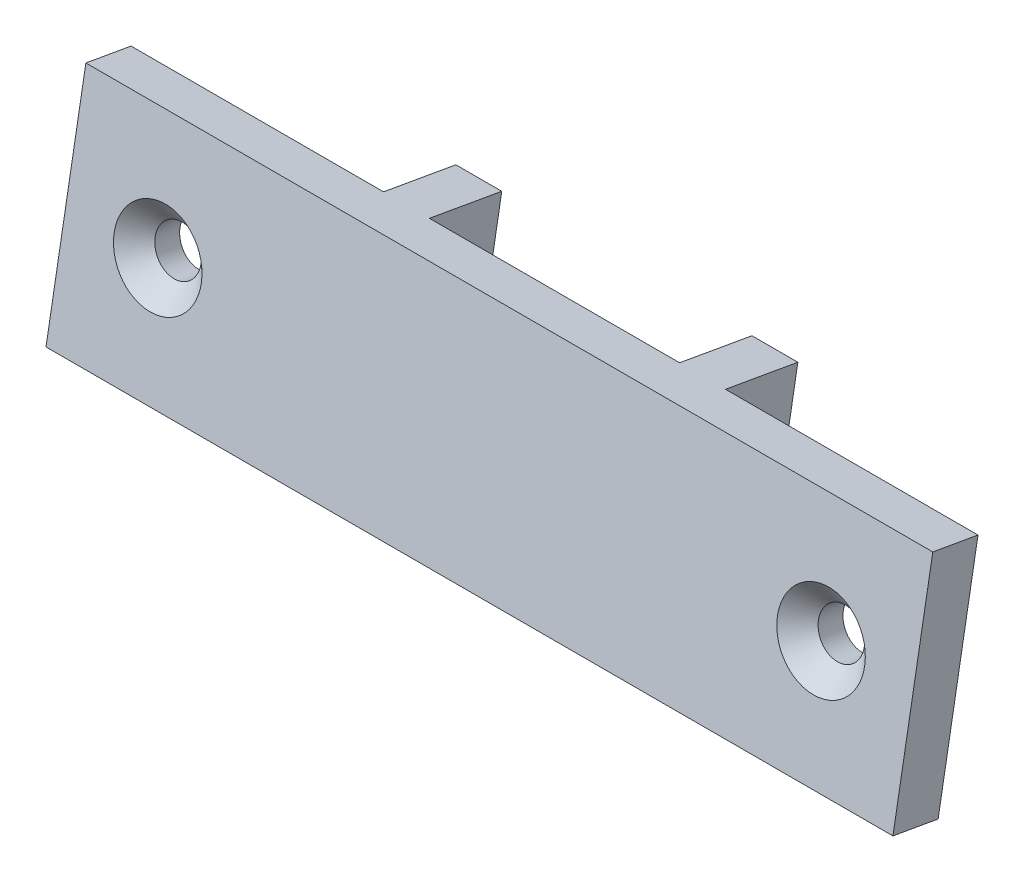
ISO-10303-21;
HEADER;
FILE_DESCRIPTION(('STEP AP214'),'2;1');
FILE_NAME('part.step','',(''),(''),'','','');
FILE_SCHEMA(('AUTOMOTIVE_DESIGN { 1 0 10303 214 1 1 1 1 }'));
ENDSEC;
DATA;
#1=APPLICATION_CONTEXT('core data for automotive mechanical design processes');
#2=APPLICATION_PROTOCOL_DEFINITION('international standard','automotive_design',2000,#1);
#3=PRODUCT_CONTEXT('',#1,'mechanical');
#4=PRODUCT('Part','Part','',(#3));
#5=PRODUCT_RELATED_PRODUCT_CATEGORY('part','',(#4));
#6=PRODUCT_DEFINITION_FORMATION('','',#4);
#7=PRODUCT_DEFINITION_CONTEXT('part definition',#1,'design');
#8=PRODUCT_DEFINITION('design','',#6,#7);
#9=PRODUCT_DEFINITION_SHAPE('','',#8);
#10=(LENGTH_UNIT() NAMED_UNIT(*) SI_UNIT(.MILLI.,.METRE.));
#11=(NAMED_UNIT(*) PLANE_ANGLE_UNIT() SI_UNIT($,.RADIAN.));
#12=(NAMED_UNIT(*) SI_UNIT($,.STERADIAN.) SOLID_ANGLE_UNIT());
#13=UNCERTAINTY_MEASURE_WITH_UNIT(LENGTH_MEASURE(1.E-05),#10,'distance_accuracy_value','');
#14=(GEOMETRIC_REPRESENTATION_CONTEXT(3) GLOBAL_UNCERTAINTY_ASSIGNED_CONTEXT((#13)) GLOBAL_UNIT_ASSIGNED_CONTEXT((#10,
#11,#12)) REPRESENTATION_CONTEXT('',''));
#15=CARTESIAN_POINT('',(0.,0.,0.));
#16=DIRECTION('',(0.,0.,1.));
#17=DIRECTION('',(1.,0.,0.));
#18=AXIS2_PLACEMENT_3D('',#15,#16,#17);
#19=CARTESIAN_POINT('',(0.,-1.36313819468535,-7.73074086114584));
#20=DIRECTION('',(0.,0.173648177666923,0.984807753012209));
#21=DIRECTION('',(0.,-0.984807753012209,0.173648177666923));
#22=AXIS2_PLACEMENT_3D('',#19,#20,#21);
#23=PLANE('',#22);
#24=CARTESIAN_POINT('',(14.45,-9.6355233199879,-6.27209616874369));
#25=DIRECTION('',(0.,0.173648177666923,0.984807753012209));
#26=DIRECTION('',(0.,-0.984807753012209,0.173648177666923));
#27=AXIS2_PLACEMENT_3D('',#24,#25,#26);
#28=CIRCLE('',#27,1.);
#29=CARTESIAN_POINT('',(14.45,-10.6203310730001,-6.09844799107677));
#30=VERTEX_POINT('',#29);
#31=EDGE_CURVE('E197',#30,#30,#28,.T.);
#32=ORIENTED_EDGE('',*,*,#31,.T.);
#33=EDGE_LOOP('',(#32));
#34=FACE_BOUND('',#33,.T.);
#35=DIRECTION('',(0.,-0.984807753012209,0.173648177666923));
#36=VECTOR('',#35,1.);
#37=CARTESIAN_POINT('',(7.45,-4.71148455492685,-7.14033705707831));
#38=LINE('',#37,#36);
#39=CARTESIAN_POINT('',(7.45,-4.71148455492685,-7.14033705707831));
#40=VERTEX_POINT('',#39);
#41=CARTESIAN_POINT('',(7.45,-14.5595620850489,-5.40385528040907));
#42=VERTEX_POINT('',#41);
#43=EDGE_CURVE('E162',#40,#42,#38,.T.);
#44=ORIENTED_EDGE('',*,*,#43,.F.);
#45=DIRECTION('',(-1.,0.,0.));
#46=VECTOR('',#45,1.);
#47=CARTESIAN_POINT('',(-18.45,-4.71148455492685,-7.14033705707831));
#48=LINE('',#47,#46);
#49=CARTESIAN_POINT('',(18.45,-4.71148455492685,-7.14033705707831));
#50=VERTEX_POINT('',#49);
#51=EDGE_CURVE('E214',#50,#40,#48,.T.);
#52=ORIENTED_EDGE('',*,*,#51,.F.);
#53=DIRECTION('',(0.,0.984807753012209,-0.173648177666923));
#54=VECTOR('',#53,1.);
#55=CARTESIAN_POINT('',(18.45,-4.71148455492685,-7.14033705707831));
#56=LINE('',#55,#54);
#57=CARTESIAN_POINT('',(18.45,-14.5595620850489,-5.40385528040907));
#58=VERTEX_POINT('',#57);
#59=EDGE_CURVE('E209',#58,#50,#56,.T.);
#60=ORIENTED_EDGE('',*,*,#59,.F.);
#61=DIRECTION('',(1.,0.,0.));
#62=VECTOR('',#61,1.);
#63=CARTESIAN_POINT('',(-18.45,-14.5595620850489,-5.40385528040907));
#64=LINE('',#63,#62);
#65=EDGE_CURVE('E57',#42,#58,#64,.T.);
#66=ORIENTED_EDGE('',*,*,#65,.F.);
#67=EDGE_LOOP('',(#44,#52,#60,#66));
#68=FACE_BOUND('',#67,.T.);
#69=ADVANCED_FACE('F41',(#34,#68),#23,.F.);
#70=DIRECTION('',(0.,0.984807753012209,-0.173648177666923));
#71=VECTOR('',#70,1.);
#72=CARTESIAN_POINT('',(5.45,-4.71148455492685,-7.14033705707831));
#73=LINE('',#72,#71);
#74=CARTESIAN_POINT('',(5.45,-14.5595620850489,-5.40385528040907));
#75=VERTEX_POINT('',#74);
#76=CARTESIAN_POINT('',(5.45,-4.71148455492685,-7.14033705707831));
#77=VERTEX_POINT('',#76);
#78=EDGE_CURVE('E65',#75,#77,#73,.T.);
#79=ORIENTED_EDGE('',*,*,#78,.F.);
#80=CARTESIAN_POINT('',(-5.45,-14.559562085049,-5.40385528040908));
#81=VERTEX_POINT('',#80);
#82=EDGE_CURVE('E210',#81,#75,#64,.T.);
#83=ORIENTED_EDGE('',*,*,#82,.F.);
#84=DIRECTION('',(0.,-0.984807753012209,0.173648177666923));
#85=VECTOR('',#84,1.);
#86=CARTESIAN_POINT('',(-5.45,-14.559562085049,-5.40385528040908));
#87=LINE('',#86,#85);
#88=CARTESIAN_POINT('',(-5.45,-4.71148455492685,-7.14033705707831));
#89=VERTEX_POINT('',#88);
#90=EDGE_CURVE('E178',#89,#81,#87,.T.);
#91=ORIENTED_EDGE('',*,*,#90,.F.);
#92=EDGE_CURVE('E216',#77,#89,#48,.T.);
#93=ORIENTED_EDGE('',*,*,#92,.F.);
#94=EDGE_LOOP('',(#79,#83,#91,#93));
#95=FACE_BOUND('',#94,.T.);
#96=ADVANCED_FACE('F255',(#95),#23,.F.);
#97=CARTESIAN_POINT('',(-14.45,-9.6355233199879,-6.27209616874369));
#98=DIRECTION('',(0.,0.173648177666923,0.984807753012209));
#99=DIRECTION('',(0.,-0.984807753012209,0.173648177666923));
#100=AXIS2_PLACEMENT_3D('',#97,#98,#99);
#101=CIRCLE('',#100,1.);
#102=CARTESIAN_POINT('',(-14.45,-10.6203310730001,-6.09844799107677));
#103=VERTEX_POINT('',#102);
#104=EDGE_CURVE('E278',#103,#103,#101,.F.);
#105=ORIENTED_EDGE('',*,*,#104,.F.);
#106=EDGE_LOOP('',(#105));
#107=FACE_BOUND('',#106,.T.);
#108=DIRECTION('',(0.,0.984807753012209,-0.173648177666923));
#109=VECTOR('',#108,1.);
#110=CARTESIAN_POINT('',(-7.45,-14.559562085049,-5.40385528040908));
#111=LINE('',#110,#109);
#112=CARTESIAN_POINT('',(-7.45,-14.5595620850489,-5.40385528040907));
#113=VERTEX_POINT('',#112);
#114=CARTESIAN_POINT('',(-7.45,-4.71148455492685,-7.14033705707831));
#115=VERTEX_POINT('',#114);
#116=EDGE_CURVE('E174',#113,#115,#111,.T.);
#117=ORIENTED_EDGE('',*,*,#116,.F.);
#118=CARTESIAN_POINT('',(-18.45,-14.5595620850489,-5.40385528040907));
#119=VERTEX_POINT('',#118);
#120=EDGE_CURVE('E206',#119,#113,#64,.T.);
#121=ORIENTED_EDGE('',*,*,#120,.F.);
#122=DIRECTION('',(0.,-0.984807753012209,0.173648177666923));
#123=VECTOR('',#122,1.);
#124=CARTESIAN_POINT('',(-18.45,-4.71148455492685,-7.14033705707831));
#125=LINE('',#124,#123);
#126=CARTESIAN_POINT('',(-18.45,-4.71148455492685,-7.14033705707831));
#127=VERTEX_POINT('',#126);
#128=EDGE_CURVE('E202',#127,#119,#125,.T.);
#129=ORIENTED_EDGE('',*,*,#128,.F.);
#130=EDGE_CURVE('E213',#115,#127,#48,.T.);
#131=ORIENTED_EDGE('',*,*,#130,.F.);
#132=EDGE_LOOP('',(#117,#121,#129,#131));
#133=FACE_BOUND('',#132,.T.);
#134=ADVANCED_FACE('F258',(#107,#133),#23,.F.);
#135=CARTESIAN_POINT('',(-18.45,-4.71148455492685,-7.14033705707831));
#136=DIRECTION('',(-1.,0.,0.));
#137=DIRECTION('',(0.,0.,1.));
#138=AXIS2_PLACEMENT_3D('',#135,#136,#137);
#139=PLANE('',#138);
#140=DIRECTION('',(0.,-0.984807753012209,0.173648177666923));
#141=VECTOR('',#140,1.);
#142=CARTESIAN_POINT('',(-18.45,-4.36418819959301,-5.17072155105389));
#143=LINE('',#142,#141);
#144=CARTESIAN_POINT('',(-18.45,-4.36418819959301,-5.17072155105389));
#145=VERTEX_POINT('',#144);
#146=CARTESIAN_POINT('',(-18.45,-14.2122657297151,-3.43423977438465));
#147=VERTEX_POINT('',#146);
#148=EDGE_CURVE('E155',#145,#147,#143,.T.);
#149=ORIENTED_EDGE('',*,*,#148,.F.);
#150=DIRECTION('',(0.,0.173648177666923,0.984807753012209));
#151=VECTOR('',#150,1.);
#152=CARTESIAN_POINT('',(-18.45,-4.71148455492685,-7.14033705707831));
#153=LINE('',#152,#151);
#154=EDGE_CURVE('E225',#127,#145,#153,.T.);
#155=ORIENTED_EDGE('',*,*,#154,.F.);
#156=ORIENTED_EDGE('',*,*,#128,.T.);
#157=DIRECTION('',(0.,0.173648177666923,0.984807753012209));
#158=VECTOR('',#157,1.);
#159=CARTESIAN_POINT('',(-18.45,-14.5595620850489,-5.40385528040907));
#160=LINE('',#159,#158);
#161=EDGE_CURVE('E215',#119,#147,#160,.T.);
#162=ORIENTED_EDGE('',*,*,#161,.T.);
#163=EDGE_LOOP('',(#149,#155,#156,#162));
#164=FACE_BOUND('',#163,.T.);
#165=ADVANCED_FACE('F267',(#164),#139,.T.);
#166=CARTESIAN_POINT('',(-18.45,-4.71148455492685,-7.14033705707831));
#167=DIRECTION('',(0.,0.984807753012209,-0.173648177666923));
#168=DIRECTION('',(0.,0.173648177666923,0.984807753012209));
#169=AXIS2_PLACEMENT_3D('',#166,#167,#168);
#170=PLANE('',#169);
#171=DIRECTION('',(-1.,0.,0.));
#172=VECTOR('',#171,1.);
#173=CARTESIAN_POINT('',(-18.45,-4.36418819959301,-5.17072155105389));
#174=LINE('',#173,#172);
#175=CARTESIAN_POINT('',(18.45,-4.36418819959301,-5.17072155105389));
#176=VERTEX_POINT('',#175);
#177=EDGE_CURVE('E205',#176,#145,#174,.T.);
#178=ORIENTED_EDGE('',*,*,#177,.F.);
#179=DIRECTION('',(0.,0.173648177666923,0.984807753012209));
#180=VECTOR('',#179,1.);
#181=CARTESIAN_POINT('',(18.45,-4.71148455492685,-7.14033705707831));
#182=LINE('',#181,#180);
#183=EDGE_CURVE('E228',#50,#176,#182,.T.);
#184=ORIENTED_EDGE('',*,*,#183,.F.);
#185=ORIENTED_EDGE('',*,*,#51,.T.);
#186=DIRECTION('',(0.,0.173648177666923,0.984807753012209));
#187=VECTOR('',#186,1.);
#188=CARTESIAN_POINT('',(7.45,-7.29850188280833,-21.8120413957292));
#189=LINE('',#188,#187);
#190=CARTESIAN_POINT('',(7.45,-5.26715872346101,-10.2917218667174));
#191=VERTEX_POINT('',#190);
#192=EDGE_CURVE('E146',#191,#40,#189,.T.);
#193=ORIENTED_EDGE('',*,*,#192,.F.);
#194=DIRECTION('',(1.,0.,0.));
#195=VECTOR('',#194,1.);
#196=CARTESIAN_POINT('',(7.45,-5.26715872346101,-10.2917218667174));
#197=LINE('',#196,#195);
#198=CARTESIAN_POINT('',(5.45,-5.26715872346101,-10.2917218667174));
#199=VERTEX_POINT('',#198);
#200=EDGE_CURVE('E139',#199,#191,#197,.T.);
#201=ORIENTED_EDGE('',*,*,#200,.F.);
#202=DIRECTION('',(0.,0.173648177666923,0.984807753012209));
#203=VECTOR('',#202,1.);
#204=CARTESIAN_POINT('',(5.45,-7.29850188280834,-21.8120413957292));
#205=LINE('',#204,#203);
#206=EDGE_CURVE('E130',#199,#77,#205,.T.);
#207=ORIENTED_EDGE('',*,*,#206,.T.);
#208=ORIENTED_EDGE('',*,*,#92,.T.);
#209=DIRECTION('',(0.,0.173648177666923,0.984807753012209));
#210=VECTOR('',#209,1.);
#211=CARTESIAN_POINT('',(-5.45,-7.29850188280834,-21.8120413957292));
#212=LINE('',#211,#210);
#213=CARTESIAN_POINT('',(-5.45,-5.26715872346101,-10.2917218667174));
#214=VERTEX_POINT('',#213);
#215=EDGE_CURVE('E180',#214,#89,#212,.T.);
#216=ORIENTED_EDGE('',*,*,#215,.F.);
#217=DIRECTION('',(1.,0.,0.));
#218=VECTOR('',#217,1.);
#219=CARTESIAN_POINT('',(-7.45,-5.26715872346101,-10.2917218667174));
#220=LINE('',#219,#218);
#221=CARTESIAN_POINT('',(-7.45,-5.26715872346101,-10.2917218667174));
#222=VERTEX_POINT('',#221);
#223=EDGE_CURVE('E191',#222,#214,#220,.T.);
#224=ORIENTED_EDGE('',*,*,#223,.F.);
#225=DIRECTION('',(0.,0.173648177666923,0.984807753012209));
#226=VECTOR('',#225,1.);
#227=CARTESIAN_POINT('',(-7.45,-7.29850188280833,-21.8120413957292));
#228=LINE('',#227,#226);
#229=EDGE_CURVE('E183',#222,#115,#228,.T.);
#230=ORIENTED_EDGE('',*,*,#229,.T.);
#231=ORIENTED_EDGE('',*,*,#130,.T.);
#232=ORIENTED_EDGE('',*,*,#154,.T.);
#233=EDGE_LOOP('',(#178,#184,#185,#193,#201,#207,#208,#216,#224,#230,#231,#232));
#234=FACE_BOUND('',#233,.T.);
#235=ADVANCED_FACE('F143',(#234),#170,.T.);
#236=CARTESIAN_POINT('',(18.45,-4.71148455492685,-7.14033705707831));
#237=DIRECTION('',(1.,0.,0.));
#238=DIRECTION('',(0.,0.,-1.));
#239=AXIS2_PLACEMENT_3D('',#236,#237,#238);
#240=PLANE('',#239);
#241=DIRECTION('',(0.,0.984807753012209,-0.173648177666923));
#242=VECTOR('',#241,1.);
#243=CARTESIAN_POINT('',(18.45,-4.36418819959301,-5.17072155105389));
#244=LINE('',#243,#242);
#245=CARTESIAN_POINT('',(18.45,-14.2122657297151,-3.43423977438465));
#246=VERTEX_POINT('',#245);
#247=EDGE_CURVE('E220',#246,#176,#244,.T.);
#248=ORIENTED_EDGE('',*,*,#247,.F.);
#249=DIRECTION('',(0.,0.173648177666923,0.984807753012209));
#250=VECTOR('',#249,1.);
#251=CARTESIAN_POINT('',(18.45,-14.5595620850489,-5.40385528040907));
#252=LINE('',#251,#250);
#253=EDGE_CURVE('E230',#58,#246,#252,.T.);
#254=ORIENTED_EDGE('',*,*,#253,.F.);
#255=ORIENTED_EDGE('',*,*,#59,.T.);
#256=ORIENTED_EDGE('',*,*,#183,.T.);
#257=EDGE_LOOP('',(#248,#254,#255,#256));
#258=FACE_BOUND('',#257,.T.);
#259=ADVANCED_FACE('F301',(#258),#240,.T.);
#260=CARTESIAN_POINT('',(-18.45,-14.5595620850489,-5.40385528040907));
#261=DIRECTION('',(0.,-0.984807753012209,0.173648177666923));
#262=DIRECTION('',(0.,-0.173648177666923,-0.984807753012209));
#263=AXIS2_PLACEMENT_3D('',#260,#261,#262);
#264=PLANE('',#263);
#265=DIRECTION('',(1.,0.,0.));
#266=VECTOR('',#265,1.);
#267=CARTESIAN_POINT('',(-18.45,-14.2122657297151,-3.43423977438465));
#268=LINE('',#267,#266);
#269=EDGE_CURVE('E158',#147,#246,#268,.T.);
#270=ORIENTED_EDGE('',*,*,#269,.F.);
#271=ORIENTED_EDGE('',*,*,#161,.F.);
#272=ORIENTED_EDGE('',*,*,#120,.T.);
#273=DIRECTION('',(0.,0.173648177666923,0.984807753012209));
#274=VECTOR('',#273,1.);
#275=CARTESIAN_POINT('',(-7.45,-17.1465794129304,-20.0755596190599));
#276=LINE('',#275,#274);
#277=CARTESIAN_POINT('',(-7.45,-15.1152362535831,-8.55524009004817));
#278=VERTEX_POINT('',#277);
#279=EDGE_CURVE('E171',#278,#113,#276,.T.);
#280=ORIENTED_EDGE('',*,*,#279,.F.);
#281=DIRECTION('',(-1.,0.,0.));
#282=VECTOR('',#281,1.);
#283=CARTESIAN_POINT('',(-7.45,-15.1152362535831,-8.55524009004817));
#284=LINE('',#283,#282);
#285=CARTESIAN_POINT('',(-5.45,-15.1152362535831,-8.55524009004817));
#286=VERTEX_POINT('',#285);
#287=EDGE_CURVE('E179',#286,#278,#284,.T.);
#288=ORIENTED_EDGE('',*,*,#287,.F.);
#289=DIRECTION('',(0.,0.173648177666923,0.984807753012209));
#290=VECTOR('',#289,1.);
#291=CARTESIAN_POINT('',(-5.45,-17.1465794129304,-20.0755596190599));
#292=LINE('',#291,#290);
#293=EDGE_CURVE('E175',#286,#81,#292,.T.);
#294=ORIENTED_EDGE('',*,*,#293,.T.);
#295=ORIENTED_EDGE('',*,*,#82,.T.);
#296=DIRECTION('',(0.,0.173648177666923,0.984807753012209));
#297=VECTOR('',#296,1.);
#298=CARTESIAN_POINT('',(5.45,-17.1465794129304,-20.0755596190599));
#299=LINE('',#298,#297);
#300=CARTESIAN_POINT('',(5.45,-15.1152362535831,-8.55524009004817));
#301=VERTEX_POINT('',#300);
#302=EDGE_CURVE('E168',#301,#75,#299,.T.);
#303=ORIENTED_EDGE('',*,*,#302,.F.);
#304=DIRECTION('',(-1.,0.,0.));
#305=VECTOR('',#304,1.);
#306=CARTESIAN_POINT('',(7.45,-15.1152362535831,-8.55524009004817));
#307=LINE('',#306,#305);
#308=CARTESIAN_POINT('',(7.45,-15.1152362535831,-8.55524009004817));
#309=VERTEX_POINT('',#308);
#310=EDGE_CURVE('E154',#309,#301,#307,.T.);
#311=ORIENTED_EDGE('',*,*,#310,.F.);
#312=DIRECTION('',(0.,0.173648177666923,0.984807753012209));
#313=VECTOR('',#312,1.);
#314=CARTESIAN_POINT('',(7.45,-17.1465794129304,-20.0755596190599));
#315=LINE('',#314,#313);
#316=EDGE_CURVE('E166',#309,#42,#315,.T.);
#317=ORIENTED_EDGE('',*,*,#316,.T.);
#318=ORIENTED_EDGE('',*,*,#65,.T.);
#319=ORIENTED_EDGE('',*,*,#253,.T.);
#320=EDGE_LOOP('',(#270,#271,#272,#280,#288,#294,#295,#303,#311,#317,#318,#319));
#321=FACE_BOUND('',#320,.T.);
#322=ADVANCED_FACE('F285',(#321),#264,.T.);
#323=CARTESIAN_POINT('',(0.,-1.0158418393515,-5.76112535512143));
#324=DIRECTION('',(0.,0.173648177666923,0.984807753012209));
#325=DIRECTION('',(0.,-0.984807753012209,0.173648177666923));
#326=AXIS2_PLACEMENT_3D('',#323,#324,#325);
#327=PLANE('',#326);
#328=CARTESIAN_POINT('',(-14.45,-9.28822696465405,-4.30248066271927));
#329=DIRECTION('',(0.,0.173648177666923,0.984807753012209));
#330=DIRECTION('',(0.,-0.984807753012209,0.173648177666923));
#331=AXIS2_PLACEMENT_3D('',#328,#329,#330);
#332=CIRCLE('',#331,1.90000000000002);
#333=CARTESIAN_POINT('',(-14.45,-11.1593616953773,-3.97254912515211));
#334=VERTEX_POINT('',#333);
#335=EDGE_CURVE('E50',#334,#334,#332,.F.);
#336=ORIENTED_EDGE('',*,*,#335,.T.);
#337=EDGE_LOOP('',(#336));
#338=FACE_BOUND('',#337,.T.);
#339=CARTESIAN_POINT('',(14.45,-9.28822696465406,-4.30248066271927));
#340=DIRECTION('',(0.,0.173648177666923,0.984807753012209));
#341=DIRECTION('',(0.,-0.984807753012209,0.173648177666923));
#342=AXIS2_PLACEMENT_3D('',#339,#340,#341);
#343=CIRCLE('',#342,1.89999999999995);
#344=CARTESIAN_POINT('',(14.45,-11.1593616953772,-3.97254912515213));
#345=VERTEX_POINT('',#344);
#346=EDGE_CURVE('E235',#345,#345,#343,.F.);
#347=ORIENTED_EDGE('',*,*,#346,.T.);
#348=EDGE_LOOP('',(#347));
#349=FACE_BOUND('',#348,.T.);
#350=ORIENTED_EDGE('',*,*,#148,.T.);
#351=ORIENTED_EDGE('',*,*,#269,.T.);
#352=ORIENTED_EDGE('',*,*,#247,.T.);
#353=ORIENTED_EDGE('',*,*,#177,.T.);
#354=EDGE_LOOP('',(#350,#351,#352,#353));
#355=FACE_BOUND('',#354,.T.);
#356=ADVANCED_FACE('F240',(#338,#349,#355),#327,.T.);
#357=CARTESIAN_POINT('',(-7.45,-17.1465794129304,-20.0755596190599));
#358=DIRECTION('',(1.,0.,0.));
#359=DIRECTION('',(0.,1.,0.));
#360=AXIS2_PLACEMENT_3D('',#357,#358,#359);
#361=PLANE('',#360);
#362=DIRECTION('',(0.,0.984807753012209,-0.173648177666923));
#363=VECTOR('',#362,1.);
#364=CARTESIAN_POINT('',(-7.45,-15.1152362535831,-8.55524009004817));
#365=LINE('',#364,#363);
#366=EDGE_CURVE('E188',#278,#222,#365,.T.);
#367=ORIENTED_EDGE('',*,*,#366,.F.);
#368=ORIENTED_EDGE('',*,*,#279,.T.);
#369=ORIENTED_EDGE('',*,*,#116,.T.);
#370=ORIENTED_EDGE('',*,*,#229,.F.);
#371=EDGE_LOOP('',(#367,#368,#369,#370));
#372=FACE_BOUND('',#371,.T.);
#373=ADVANCED_FACE('F288',(#372),#361,.F.);
#374=CARTESIAN_POINT('',(-5.45,-17.1465794129304,-20.0755596190599));
#375=DIRECTION('',(-1.,0.,0.));
#376=DIRECTION('',(0.,-1.,0.));
#377=AXIS2_PLACEMENT_3D('',#374,#375,#376);
#378=PLANE('',#377);
#379=DIRECTION('',(0.,-0.984807753012209,0.173648177666923));
#380=VECTOR('',#379,1.);
#381=CARTESIAN_POINT('',(-5.45,-15.1152362535831,-8.55524009004817));
#382=LINE('',#381,#380);
#383=EDGE_CURVE('E194',#214,#286,#382,.T.);
#384=ORIENTED_EDGE('',*,*,#383,.F.);
#385=ORIENTED_EDGE('',*,*,#215,.T.);
#386=ORIENTED_EDGE('',*,*,#90,.T.);
#387=ORIENTED_EDGE('',*,*,#293,.F.);
#388=EDGE_LOOP('',(#384,#385,#386,#387));
#389=FACE_BOUND('',#388,.T.);
#390=ADVANCED_FACE('F292',(#389),#378,.F.);
#391=CARTESIAN_POINT('',(-10.45,-20.186996181596,-7.66095197506352));
#392=DIRECTION('',(0.,-0.173648177666923,-0.984807753012209));
#393=DIRECTION('',(0.,0.984807753012209,-0.173648177666923));
#394=AXIS2_PLACEMENT_3D('',#391,#392,#393);
#395=PLANE('',#394);
#396=ORIENTED_EDGE('',*,*,#287,.T.);
#397=ORIENTED_EDGE('',*,*,#366,.T.);
#398=ORIENTED_EDGE('',*,*,#223,.T.);
#399=ORIENTED_EDGE('',*,*,#383,.T.);
#400=EDGE_LOOP('',(#396,#397,#398,#399));
#401=FACE_BOUND('',#400,.T.);
#402=ADVANCED_FACE('F290',(#401),#395,.T.);
#403=CARTESIAN_POINT('',(7.45,-7.29850188280833,-21.8120413957292));
#404=DIRECTION('',(-1.,0.,0.));
#405=DIRECTION('',(0.,-1.,0.));
#406=AXIS2_PLACEMENT_3D('',#403,#404,#405);
#407=PLANE('',#406);
#408=DIRECTION('',(0.,-0.984807753012209,0.173648177666923));
#409=VECTOR('',#408,1.);
#410=CARTESIAN_POINT('',(7.45,-5.26715872346102,-10.2917218667174));
#411=LINE('',#410,#409);
#412=EDGE_CURVE('E150',#191,#309,#411,.T.);
#413=ORIENTED_EDGE('',*,*,#412,.F.);
#414=ORIENTED_EDGE('',*,*,#192,.T.);
#415=ORIENTED_EDGE('',*,*,#43,.T.);
#416=ORIENTED_EDGE('',*,*,#316,.F.);
#417=EDGE_LOOP('',(#413,#414,#415,#416));
#418=FACE_BOUND('',#417,.T.);
#419=ADVANCED_FACE('F305',(#418),#407,.F.);
#420=CARTESIAN_POINT('',(5.45,-7.29850188280834,-21.8120413957292));
#421=DIRECTION('',(1.,0.,0.));
#422=DIRECTION('',(0.,1.,0.));
#423=AXIS2_PLACEMENT_3D('',#420,#421,#422);
#424=PLANE('',#423);
#425=DIRECTION('',(0.,0.984807753012209,-0.173648177666923));
#426=VECTOR('',#425,1.);
#427=CARTESIAN_POINT('',(5.45,-5.26715872346102,-10.2917218667174));
#428=LINE('',#427,#426);
#429=EDGE_CURVE('E135',#301,#199,#428,.T.);
#430=ORIENTED_EDGE('',*,*,#429,.F.);
#431=ORIENTED_EDGE('',*,*,#302,.T.);
#432=ORIENTED_EDGE('',*,*,#78,.T.);
#433=ORIENTED_EDGE('',*,*,#206,.F.);
#434=EDGE_LOOP('',(#430,#431,#432,#433));
#435=FACE_BOUND('',#434,.T.);
#436=ADVANCED_FACE('F132',(#435),#424,.F.);
#437=CARTESIAN_POINT('',(-10.45,-20.186996181596,-7.66095197506352));
#438=DIRECTION('',(0.,-0.173648177666923,-0.984807753012209));
#439=DIRECTION('',(0.,0.984807753012209,-0.173648177666923));
#440=AXIS2_PLACEMENT_3D('',#437,#438,#439);
#441=PLANE('',#440);
#442=ORIENTED_EDGE('',*,*,#200,.T.);
#443=ORIENTED_EDGE('',*,*,#412,.T.);
#444=ORIENTED_EDGE('',*,*,#310,.T.);
#445=ORIENTED_EDGE('',*,*,#429,.T.);
#446=EDGE_LOOP('',(#442,#443,#444,#445));
#447=FACE_BOUND('',#446,.T.);
#448=ADVANCED_FACE('F153',(#447),#441,.T.);
#449=CARTESIAN_POINT('',(14.45,-20.4729838836911,-67.7343892344998));
#450=DIRECTION('',(0.,0.173648177666923,0.984807753012209));
#451=DIRECTION('',(0.,-0.984807753012209,0.173648177666923));
#452=AXIS2_PLACEMENT_3D('',#449,#450,#451);
#453=CYLINDRICAL_SURFACE('',#452,1.);
#454=CARTESIAN_POINT('',(14.45,-9.44451032455428,-5.18880764043024));
#455=DIRECTION('',(0.,0.173648177666923,0.984807753012209));
#456=DIRECTION('',(0.,-0.984807753012209,0.173648177666923));
#457=AXIS2_PLACEMENT_3D('',#454,#455,#456);
#458=CIRCLE('',#457,1.);
#459=CARTESIAN_POINT('',(14.45,-10.4293180775665,-5.01515946276332));
#460=VERTEX_POINT('',#459);
#461=EDGE_CURVE('E227',#460,#460,#458,.T.);
#462=ORIENTED_EDGE('',*,*,#461,.T.);
#463=EDGE_LOOP('',(#462));
#464=FACE_BOUND('',#463,.T.);
#465=ORIENTED_EDGE('',*,*,#31,.F.);
#466=EDGE_LOOP('',(#465));
#467=FACE_BOUND('',#466,.T.);
#468=ADVANCED_FACE('F318',(#464,#467),#453,.F.);
#469=CARTESIAN_POINT('',(14.45,-9.44451032455428,-5.18880764043023));
#470=DIRECTION('',(0.,0.173648177666923,0.984807753012209));
#471=DIRECTION('',(0.,-0.984807753012209,0.173648177666923));
#472=AXIS2_PLACEMENT_3D('',#469,#470,#471);
#473=CONICAL_SURFACE('',#472,1.,0.785398163397441);
#474=ORIENTED_EDGE('',*,*,#346,.F.);
#475=EDGE_LOOP('',(#474));
#476=FACE_BOUND('',#475,.T.);
#477=ORIENTED_EDGE('',*,*,#461,.F.);
#478=EDGE_LOOP('',(#477));
#479=FACE_BOUND('',#478,.T.);
#480=ADVANCED_FACE('F250',(#476,#479),#473,.F.);
#481=CARTESIAN_POINT('',(-14.45,-10.4881533615915,-11.10760142255));
#482=DIRECTION('',(0.,0.173648177666923,0.984807753012209));
#483=DIRECTION('',(0.,-0.984807753012209,0.173648177666923));
#484=AXIS2_PLACEMENT_3D('',#481,#482,#483);
#485=CYLINDRICAL_SURFACE('',#484,1.);
#486=CARTESIAN_POINT('',(-14.45,-9.44451032455429,-5.18880764043026));
#487=DIRECTION('',(0.,0.173648177666922,0.98480775301221));
#488=DIRECTION('',(0.,-0.98480775301221,0.173648177666922));
#489=AXIS2_PLACEMENT_3D('',#486,#487,#488);
#490=CIRCLE('',#489,1.);
#491=CARTESIAN_POINT('',(-14.45,-10.4293180775665,-5.01515946276334));
#492=VERTEX_POINT('',#491);
#493=EDGE_CURVE('E11',#492,#492,#490,.T.);
#494=ORIENTED_EDGE('',*,*,#493,.T.);
#495=EDGE_LOOP('',(#494));
#496=FACE_BOUND('',#495,.T.);
#497=ORIENTED_EDGE('',*,*,#104,.T.);
#498=EDGE_LOOP('',(#497));
#499=FACE_BOUND('',#498,.T.);
#500=ADVANCED_FACE('F244',(#496,#499),#485,.F.);
#501=CARTESIAN_POINT('',(-14.45,-9.28822696465405,-4.30248066271927));
#502=DIRECTION('',(0.,0.173648177666922,0.98480775301221));
#503=DIRECTION('',(0.,-0.98480775301221,0.173648177666922));
#504=AXIS2_PLACEMENT_3D('',#501,#502,#503);
#505=CONICAL_SURFACE('',#504,1.90000000000002,0.785398163397454);
#506=ORIENTED_EDGE('',*,*,#493,.F.);
#507=EDGE_LOOP('',(#506));
#508=FACE_BOUND('',#507,.T.);
#509=ORIENTED_EDGE('',*,*,#335,.F.);
#510=EDGE_LOOP('',(#509));
#511=FACE_BOUND('',#510,.T.);
#512=ADVANCED_FACE('F44',(#508,#511),#505,.F.);
#513=CLOSED_SHELL('',(#69,#96,#134,#165,#235,#259,#322,#356,#373,#390,#402,#419,#436,#448,#468,
#480,#500,#512));
#514=MANIFOLD_SOLID_BREP('B2',#513);
#515=ADVANCED_BREP_SHAPE_REPRESENTATION('',(#18,#514),#14);
#516=SHAPE_DEFINITION_REPRESENTATION(#9,#515);
ENDSEC;
END-ISO-10303-21;
